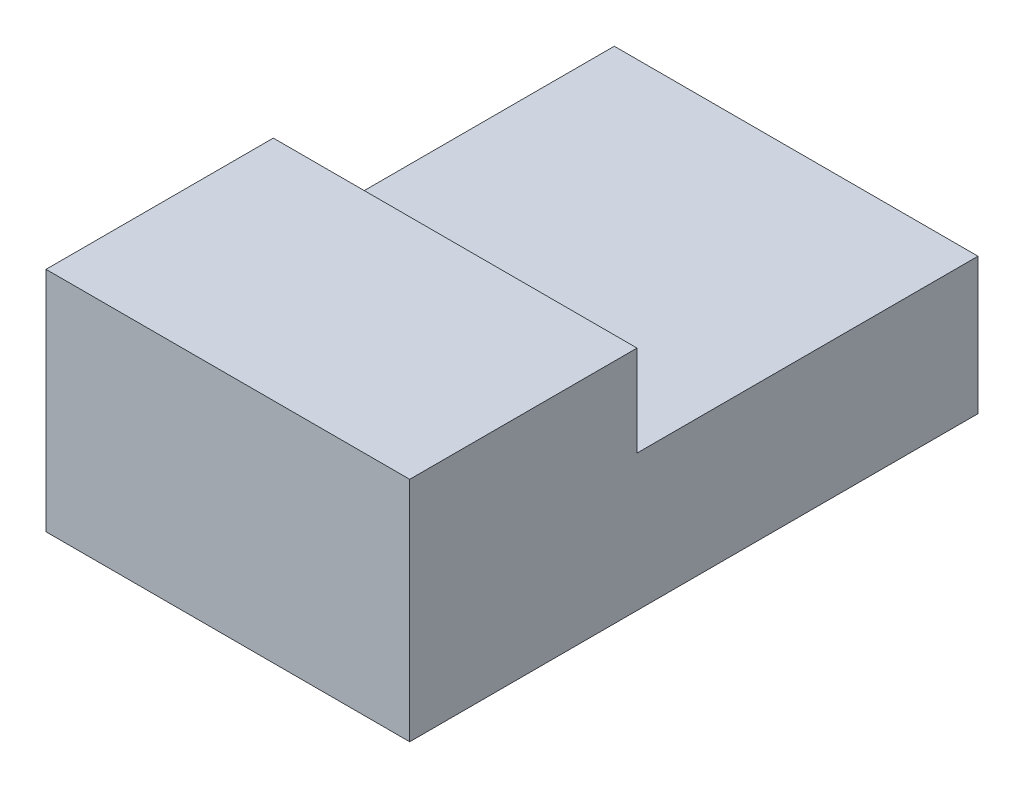
ISO-10303-21;
HEADER;
FILE_DESCRIPTION(('STEP AP214'),'2;1');
FILE_NAME('part.step','',(''),(''),'','','');
FILE_SCHEMA(('AUTOMOTIVE_DESIGN { 1 0 10303 214 1 1 1 1 }'));
ENDSEC;
DATA;
#1=APPLICATION_CONTEXT('core data for automotive mechanical design processes');
#2=APPLICATION_PROTOCOL_DEFINITION('international standard','automotive_design',2000,#1);
#3=PRODUCT_CONTEXT('',#1,'mechanical');
#4=PRODUCT('Part','Part','',(#3));
#5=PRODUCT_RELATED_PRODUCT_CATEGORY('part','',(#4));
#6=PRODUCT_DEFINITION_FORMATION('','',#4);
#7=PRODUCT_DEFINITION_CONTEXT('part definition',#1,'design');
#8=PRODUCT_DEFINITION('design','',#6,#7);
#9=PRODUCT_DEFINITION_SHAPE('','',#8);
#10=(LENGTH_UNIT() NAMED_UNIT(*) SI_UNIT(.MILLI.,.METRE.));
#11=(NAMED_UNIT(*) PLANE_ANGLE_UNIT() SI_UNIT($,.RADIAN.));
#12=(NAMED_UNIT(*) SI_UNIT($,.STERADIAN.) SOLID_ANGLE_UNIT());
#13=UNCERTAINTY_MEASURE_WITH_UNIT(LENGTH_MEASURE(1.E-05),#10,'distance_accuracy_value','');
#14=(GEOMETRIC_REPRESENTATION_CONTEXT(3) GLOBAL_UNCERTAINTY_ASSIGNED_CONTEXT((#13)) GLOBAL_UNIT_ASSIGNED_CONTEXT((#10,
#11,#12)) REPRESENTATION_CONTEXT('',''));
#15=CARTESIAN_POINT('',(0.,0.,0.));
#16=DIRECTION('',(0.,0.,1.));
#17=DIRECTION('',(1.,0.,0.));
#18=AXIS2_PLACEMENT_3D('',#15,#16,#17);
#19=CARTESIAN_POINT('',(160.,0.,-250.));
#20=DIRECTION('',(0.,1.,0.));
#21=DIRECTION('',(0.,0.,1.));
#22=AXIS2_PLACEMENT_3D('',#19,#20,#21);
#23=PLANE('',#22);
#24=DIRECTION('',(0.,0.,-1.));
#25=VECTOR('',#24,1.);
#26=CARTESIAN_POINT('',(0.,0.,-250.));
#27=LINE('',#26,#25);
#28=CARTESIAN_POINT('',(0.,0.,0.));
#29=VERTEX_POINT('',#28);
#30=CARTESIAN_POINT('',(0.,0.,-250.));
#31=VERTEX_POINT('',#30);
#32=EDGE_CURVE('E140',#29,#31,#27,.T.);
#33=ORIENTED_EDGE('',*,*,#32,.T.);
#34=DIRECTION('',(-1.,0.,0.));
#35=VECTOR('',#34,1.);
#36=CARTESIAN_POINT('',(160.,0.,-250.));
#37=LINE('',#36,#35);
#38=CARTESIAN_POINT('',(160.,0.,-250.));
#39=VERTEX_POINT('',#38);
#40=EDGE_CURVE('E11',#39,#31,#37,.T.);
#41=ORIENTED_EDGE('',*,*,#40,.F.);
#42=DIRECTION('',(0.,0.,-1.));
#43=VECTOR('',#42,1.);
#44=CARTESIAN_POINT('',(160.,0.,-250.));
#45=LINE('',#44,#43);
#46=CARTESIAN_POINT('',(160.,0.,0.));
#47=VERTEX_POINT('',#46);
#48=EDGE_CURVE('E159',#47,#39,#45,.T.);
#49=ORIENTED_EDGE('',*,*,#48,.F.);
#50=DIRECTION('',(-1.,0.,0.));
#51=VECTOR('',#50,1.);
#52=CARTESIAN_POINT('',(160.,0.,0.));
#53=LINE('',#52,#51);
#54=EDGE_CURVE('E136',#47,#29,#53,.T.);
#55=ORIENTED_EDGE('',*,*,#54,.T.);
#56=EDGE_LOOP('',(#33,#41,#49,#55));
#57=FACE_BOUND('',#56,.T.);
#58=ADVANCED_FACE('F39',(#57),#23,.F.);
#59=CARTESIAN_POINT('',(160.,60.,-250.));
#60=DIRECTION('',(0.,0.,1.));
#61=DIRECTION('',(1.,0.,0.));
#62=AXIS2_PLACEMENT_3D('',#59,#60,#61);
#63=PLANE('',#62);
#64=DIRECTION('',(0.,1.,0.));
#65=VECTOR('',#64,1.);
#66=CARTESIAN_POINT('',(0.,60.,-250.));
#67=LINE('',#66,#65);
#68=CARTESIAN_POINT('',(0.,60.,-250.));
#69=VERTEX_POINT('',#68);
#70=EDGE_CURVE('E144',#31,#69,#67,.T.);
#71=ORIENTED_EDGE('',*,*,#70,.T.);
#72=DIRECTION('',(-1.,0.,0.));
#73=VECTOR('',#72,1.);
#74=CARTESIAN_POINT('',(160.,60.,-250.));
#75=LINE('',#74,#73);
#76=CARTESIAN_POINT('',(160.,60.,-250.));
#77=VERTEX_POINT('',#76);
#78=EDGE_CURVE('E47',#77,#69,#75,.T.);
#79=ORIENTED_EDGE('',*,*,#78,.F.);
#80=DIRECTION('',(0.,1.,0.));
#81=VECTOR('',#80,1.);
#82=CARTESIAN_POINT('',(160.,60.,-250.));
#83=LINE('',#82,#81);
#84=EDGE_CURVE('E98',#39,#77,#83,.T.);
#85=ORIENTED_EDGE('',*,*,#84,.F.);
#86=ORIENTED_EDGE('',*,*,#40,.T.);
#87=EDGE_LOOP('',(#71,#79,#85,#86));
#88=FACE_BOUND('',#87,.T.);
#89=ADVANCED_FACE('F260',(#88),#63,.F.);
#90=CARTESIAN_POINT('',(160.,60.,-100.));
#91=DIRECTION('',(0.,-1.,0.));
#92=DIRECTION('',(0.,0.,-1.));
#93=AXIS2_PLACEMENT_3D('',#90,#91,#92);
#94=PLANE('',#93);
#95=DIRECTION('',(0.,0.,1.));
#96=VECTOR('',#95,1.);
#97=CARTESIAN_POINT('',(0.,60.,-100.));
#98=LINE('',#97,#96);
#99=CARTESIAN_POINT('',(0.,60.,-100.));
#100=VERTEX_POINT('',#99);
#101=EDGE_CURVE('E148',#69,#100,#98,.T.);
#102=ORIENTED_EDGE('',*,*,#101,.T.);
#103=DIRECTION('',(-1.,0.,0.));
#104=VECTOR('',#103,1.);
#105=CARTESIAN_POINT('',(160.,60.,-100.));
#106=LINE('',#105,#104);
#107=CARTESIAN_POINT('',(2.70000000000001,60.,-100.));
#108=VERTEX_POINT('',#107);
#109=EDGE_CURVE('E129',#108,#100,#106,.T.);
#110=ORIENTED_EDGE('',*,*,#109,.F.);
#111=DIRECTION('',(0.,0.,-1.));
#112=VECTOR('',#111,1.);
#113=CARTESIAN_POINT('',(2.70000000000001,60.,-2.70000000000001));
#114=LINE('',#113,#112);
#115=CARTESIAN_POINT('',(2.70000000000001,60.,-2.70000000000001));
#116=VERTEX_POINT('',#115);
#117=EDGE_CURVE('E188',#116,#108,#114,.T.);
#118=ORIENTED_EDGE('',*,*,#117,.F.);
#119=DIRECTION('',(-1.,0.,0.));
#120=VECTOR('',#119,1.);
#121=CARTESIAN_POINT('',(157.3,60.,-2.70000000000001));
#122=LINE('',#121,#120);
#123=CARTESIAN_POINT('',(157.3,60.,-2.70000000000001));
#124=VERTEX_POINT('',#123);
#125=EDGE_CURVE('E217',#124,#116,#122,.T.);
#126=ORIENTED_EDGE('',*,*,#125,.F.);
#127=DIRECTION('',(0.,0.,-1.));
#128=VECTOR('',#127,1.);
#129=CARTESIAN_POINT('',(157.3,60.,-2.70000000000001));
#130=LINE('',#129,#128);
#131=CARTESIAN_POINT('',(157.3,60.,-100.));
#132=VERTEX_POINT('',#131);
#133=EDGE_CURVE('E184',#124,#132,#130,.T.);
#134=ORIENTED_EDGE('',*,*,#133,.T.);
#135=CARTESIAN_POINT('',(160.,60.,-100.));
#136=VERTEX_POINT('',#135);
#137=EDGE_CURVE('E164',#136,#132,#106,.T.);
#138=ORIENTED_EDGE('',*,*,#137,.F.);
#139=DIRECTION('',(0.,0.,1.));
#140=VECTOR('',#139,1.);
#141=CARTESIAN_POINT('',(160.,60.,-100.));
#142=LINE('',#141,#140);
#143=EDGE_CURVE('E115',#77,#136,#142,.T.);
#144=ORIENTED_EDGE('',*,*,#143,.F.);
#145=ORIENTED_EDGE('',*,*,#78,.T.);
#146=EDGE_LOOP('',(#102,#110,#118,#126,#134,#138,#144,#145));
#147=FACE_BOUND('',#146,.T.);
#148=ADVANCED_FACE('F170',(#147),#94,.F.);
#149=CARTESIAN_POINT('',(160.,100.,-100.));
#150=DIRECTION('',(0.,0.,1.));
#151=DIRECTION('',(1.,0.,0.));
#152=AXIS2_PLACEMENT_3D('',#149,#150,#151);
#153=PLANE('',#152);
#154=ORIENTED_EDGE('',*,*,#137,.T.);
#155=DIRECTION('',(0.,-1.,0.));
#156=VECTOR('',#155,1.);
#157=CARTESIAN_POINT('',(157.3,97.3,-100.));
#158=LINE('',#157,#156);
#159=CARTESIAN_POINT('',(157.3,97.3,-100.));
#160=VERTEX_POINT('',#159);
#161=EDGE_CURVE('E54',#160,#132,#158,.T.);
#162=ORIENTED_EDGE('',*,*,#161,.F.);
#163=DIRECTION('',(1.,0.,0.));
#164=VECTOR('',#163,1.);
#165=CARTESIAN_POINT('',(157.3,97.3,-100.));
#166=LINE('',#165,#164);
#167=CARTESIAN_POINT('',(2.70000000000001,97.3,-100.));
#168=VERTEX_POINT('',#167);
#169=EDGE_CURVE('E199',#168,#160,#166,.T.);
#170=ORIENTED_EDGE('',*,*,#169,.F.);
#171=DIRECTION('',(0.,1.,0.));
#172=VECTOR('',#171,1.);
#173=CARTESIAN_POINT('',(2.70000000000001,97.3,-100.));
#174=LINE('',#173,#172);
#175=EDGE_CURVE('E204',#108,#168,#174,.T.);
#176=ORIENTED_EDGE('',*,*,#175,.F.);
#177=ORIENTED_EDGE('',*,*,#109,.T.);
#178=DIRECTION('',(0.,1.,0.));
#179=VECTOR('',#178,1.);
#180=CARTESIAN_POINT('',(0.,100.,-100.));
#181=LINE('',#180,#179);
#182=CARTESIAN_POINT('',(0.,100.,-100.));
#183=VERTEX_POINT('',#182);
#184=EDGE_CURVE('E125',#100,#183,#181,.T.);
#185=ORIENTED_EDGE('',*,*,#184,.T.);
#186=DIRECTION('',(-1.,0.,0.));
#187=VECTOR('',#186,1.);
#188=CARTESIAN_POINT('',(160.,100.,-100.));
#189=LINE('',#188,#187);
#190=CARTESIAN_POINT('',(160.,100.,-100.));
#191=VERTEX_POINT('',#190);
#192=EDGE_CURVE('E122',#191,#183,#189,.T.);
#193=ORIENTED_EDGE('',*,*,#192,.F.);
#194=DIRECTION('',(0.,1.,0.));
#195=VECTOR('',#194,1.);
#196=CARTESIAN_POINT('',(160.,100.,-100.));
#197=LINE('',#196,#195);
#198=EDGE_CURVE('E108',#136,#191,#197,.T.);
#199=ORIENTED_EDGE('',*,*,#198,.F.);
#200=EDGE_LOOP('',(#154,#162,#170,#176,#177,#185,#193,#199));
#201=FACE_BOUND('',#200,.T.);
#202=ADVANCED_FACE('F123',(#201),#153,.F.);
#203=CARTESIAN_POINT('',(160.,100.,0.));
#204=DIRECTION('',(0.,-1.,0.));
#205=DIRECTION('',(0.,0.,-1.));
#206=AXIS2_PLACEMENT_3D('',#203,#204,#205);
#207=PLANE('',#206);
#208=DIRECTION('',(0.,0.,1.));
#209=VECTOR('',#208,1.);
#210=CARTESIAN_POINT('',(0.,100.,0.));
#211=LINE('',#210,#209);
#212=CARTESIAN_POINT('',(0.,100.,0.));
#213=VERTEX_POINT('',#212);
#214=EDGE_CURVE('E154',#183,#213,#211,.T.);
#215=ORIENTED_EDGE('',*,*,#214,.T.);
#216=DIRECTION('',(-1.,0.,0.));
#217=VECTOR('',#216,1.);
#218=CARTESIAN_POINT('',(160.,100.,0.));
#219=LINE('',#218,#217);
#220=CARTESIAN_POINT('',(160.,100.,0.));
#221=VERTEX_POINT('',#220);
#222=EDGE_CURVE('E130',#221,#213,#219,.T.);
#223=ORIENTED_EDGE('',*,*,#222,.F.);
#224=DIRECTION('',(0.,0.,1.));
#225=VECTOR('',#224,1.);
#226=CARTESIAN_POINT('',(160.,100.,0.));
#227=LINE('',#226,#225);
#228=EDGE_CURVE('E112',#191,#221,#227,.T.);
#229=ORIENTED_EDGE('',*,*,#228,.F.);
#230=ORIENTED_EDGE('',*,*,#192,.T.);
#231=EDGE_LOOP('',(#215,#223,#229,#230));
#232=FACE_BOUND('',#231,.T.);
#233=ADVANCED_FACE('F132',(#232),#207,.F.);
#234=CARTESIAN_POINT('',(160.,0.,0.));
#235=DIRECTION('',(0.,0.,-1.));
#236=DIRECTION('',(-1.,0.,0.));
#237=AXIS2_PLACEMENT_3D('',#234,#235,#236);
#238=PLANE('',#237);
#239=DIRECTION('',(0.,-1.,0.));
#240=VECTOR('',#239,1.);
#241=CARTESIAN_POINT('',(0.,0.,0.));
#242=LINE('',#241,#240);
#243=EDGE_CURVE('E90',#213,#29,#242,.T.);
#244=ORIENTED_EDGE('',*,*,#243,.T.);
#245=ORIENTED_EDGE('',*,*,#54,.F.);
#246=DIRECTION('',(0.,-1.,0.));
#247=VECTOR('',#246,1.);
#248=CARTESIAN_POINT('',(160.,0.,0.));
#249=LINE('',#248,#247);
#250=EDGE_CURVE('E63',#221,#47,#249,.T.);
#251=ORIENTED_EDGE('',*,*,#250,.F.);
#252=ORIENTED_EDGE('',*,*,#222,.T.);
#253=EDGE_LOOP('',(#244,#245,#251,#252));
#254=FACE_BOUND('',#253,.T.);
#255=ADVANCED_FACE('F175',(#254),#238,.F.);
#256=CARTESIAN_POINT('',(160.,0.,0.));
#257=DIRECTION('',(-1.,0.,0.));
#258=DIRECTION('',(0.,0.,1.));
#259=AXIS2_PLACEMENT_3D('',#256,#257,#258);
#260=PLANE('',#259);
#261=ORIENTED_EDGE('',*,*,#48,.T.);
#262=ORIENTED_EDGE('',*,*,#84,.T.);
#263=ORIENTED_EDGE('',*,*,#143,.T.);
#264=ORIENTED_EDGE('',*,*,#198,.T.);
#265=ORIENTED_EDGE('',*,*,#228,.T.);
#266=ORIENTED_EDGE('',*,*,#250,.T.);
#267=EDGE_LOOP('',(#261,#262,#263,#264,#265,#266));
#268=FACE_BOUND('',#267,.T.);
#269=ADVANCED_FACE('F110',(#268),#260,.F.);
#270=CARTESIAN_POINT('',(0.,0.,0.));
#271=DIRECTION('',(-1.,0.,0.));
#272=DIRECTION('',(0.,0.,1.));
#273=AXIS2_PLACEMENT_3D('',#270,#271,#272);
#274=PLANE('',#273);
#275=ORIENTED_EDGE('',*,*,#32,.F.);
#276=ORIENTED_EDGE('',*,*,#243,.F.);
#277=ORIENTED_EDGE('',*,*,#214,.F.);
#278=ORIENTED_EDGE('',*,*,#184,.F.);
#279=ORIENTED_EDGE('',*,*,#101,.F.);
#280=ORIENTED_EDGE('',*,*,#70,.F.);
#281=EDGE_LOOP('',(#275,#276,#277,#278,#279,#280));
#282=FACE_BOUND('',#281,.T.);
#283=ADVANCED_FACE('F174',(#282),#274,.T.);
#284=CARTESIAN_POINT('',(157.3,97.3,-2.70000000000001));
#285=DIRECTION('',(1.,0.,0.));
#286=DIRECTION('',(0.,0.,-1.));
#287=AXIS2_PLACEMENT_3D('',#284,#285,#286);
#288=PLANE('',#287);
#289=ORIENTED_EDGE('',*,*,#161,.T.);
#290=ORIENTED_EDGE('',*,*,#133,.F.);
#291=DIRECTION('',(0.,-1.,0.));
#292=VECTOR('',#291,1.);
#293=CARTESIAN_POINT('',(157.3,97.3,-2.70000000000001));
#294=LINE('',#293,#292);
#295=CARTESIAN_POINT('',(157.3,97.3,-2.70000000000001));
#296=VERTEX_POINT('',#295);
#297=EDGE_CURVE('E203',#296,#124,#294,.T.);
#298=ORIENTED_EDGE('',*,*,#297,.F.);
#299=DIRECTION('',(0.,0.,-1.));
#300=VECTOR('',#299,1.);
#301=CARTESIAN_POINT('',(157.3,97.3,-2.70000000000001));
#302=LINE('',#301,#300);
#303=EDGE_CURVE('E145',#296,#160,#302,.T.);
#304=ORIENTED_EDGE('',*,*,#303,.T.);
#305=EDGE_LOOP('',(#289,#290,#298,#304));
#306=FACE_BOUND('',#305,.T.);
#307=ADVANCED_FACE('F231',(#306),#288,.F.);
#308=CARTESIAN_POINT('',(157.3,97.3,-2.70000000000001));
#309=DIRECTION('',(0.,1.,0.));
#310=DIRECTION('',(0.,0.,1.));
#311=AXIS2_PLACEMENT_3D('',#308,#309,#310);
#312=PLANE('',#311);
#313=ORIENTED_EDGE('',*,*,#169,.T.);
#314=ORIENTED_EDGE('',*,*,#303,.F.);
#315=DIRECTION('',(1.,0.,0.));
#316=VECTOR('',#315,1.);
#317=CARTESIAN_POINT('',(157.3,97.3,-2.70000000000001));
#318=LINE('',#317,#316);
#319=CARTESIAN_POINT('',(2.70000000000001,97.3,-2.70000000000001));
#320=VERTEX_POINT('',#319);
#321=EDGE_CURVE('E189',#320,#296,#318,.T.);
#322=ORIENTED_EDGE('',*,*,#321,.F.);
#323=DIRECTION('',(0.,0.,-1.));
#324=VECTOR('',#323,1.);
#325=CARTESIAN_POINT('',(2.70000000000001,97.3,-2.70000000000001));
#326=LINE('',#325,#324);
#327=EDGE_CURVE('E193',#320,#168,#326,.T.);
#328=ORIENTED_EDGE('',*,*,#327,.T.);
#329=EDGE_LOOP('',(#313,#314,#322,#328));
#330=FACE_BOUND('',#329,.T.);
#331=ADVANCED_FACE('F242',(#330),#312,.F.);
#332=CARTESIAN_POINT('',(2.70000000000001,97.3,-2.70000000000001));
#333=DIRECTION('',(-1.,0.,0.));
#334=DIRECTION('',(0.,0.,1.));
#335=AXIS2_PLACEMENT_3D('',#332,#333,#334);
#336=PLANE('',#335);
#337=ORIENTED_EDGE('',*,*,#175,.T.);
#338=ORIENTED_EDGE('',*,*,#327,.F.);
#339=DIRECTION('',(0.,1.,0.));
#340=VECTOR('',#339,1.);
#341=CARTESIAN_POINT('',(2.70000000000001,97.3,-2.70000000000001));
#342=LINE('',#341,#340);
#343=EDGE_CURVE('E213',#116,#320,#342,.T.);
#344=ORIENTED_EDGE('',*,*,#343,.F.);
#345=ORIENTED_EDGE('',*,*,#117,.T.);
#346=EDGE_LOOP('',(#337,#338,#344,#345));
#347=FACE_BOUND('',#346,.T.);
#348=ADVANCED_FACE('F247',(#347),#336,.F.);
#349=CARTESIAN_POINT('',(0.,0.,-2.70000000000001));
#350=DIRECTION('',(0.,0.,-1.));
#351=DIRECTION('',(-1.,0.,0.));
#352=AXIS2_PLACEMENT_3D('',#349,#350,#351);
#353=PLANE('',#352);
#354=ORIENTED_EDGE('',*,*,#297,.T.);
#355=ORIENTED_EDGE('',*,*,#125,.T.);
#356=ORIENTED_EDGE('',*,*,#343,.T.);
#357=ORIENTED_EDGE('',*,*,#321,.T.);
#358=EDGE_LOOP('',(#354,#355,#356,#357));
#359=FACE_BOUND('',#358,.T.);
#360=ADVANCED_FACE('F226',(#359),#353,.T.);
#361=CLOSED_SHELL('',(#58,#89,#148,#202,#233,#255,#269,#283,#307,#331,#348,#360));
#362=MANIFOLD_SOLID_BREP('B2',#361);
#363=ADVANCED_BREP_SHAPE_REPRESENTATION('',(#18,#362),#14);
#364=SHAPE_DEFINITION_REPRESENTATION(#9,#363);
ENDSEC;
END-ISO-10303-21;
